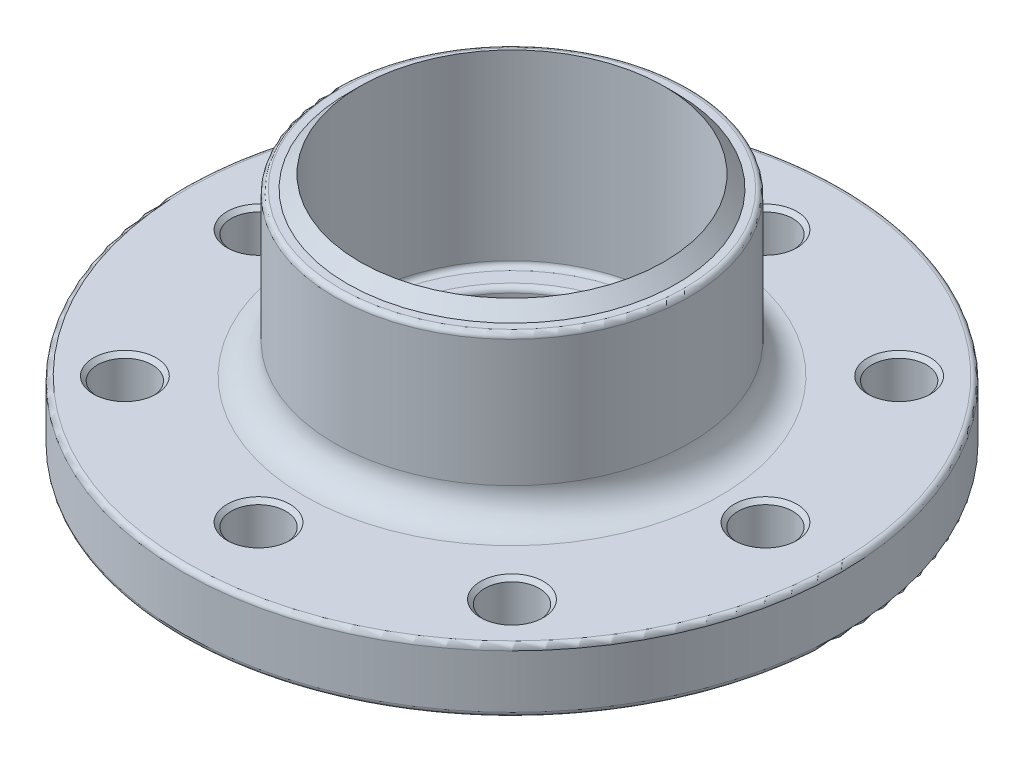
ISO-10303-21;
HEADER;
FILE_DESCRIPTION(('STEP AP214'),'2;1');
FILE_NAME('part.step','',(''),(''),'','','');
FILE_SCHEMA(('AUTOMOTIVE_DESIGN { 1 0 10303 214 1 1 1 1 }'));
ENDSEC;
DATA;
#1=APPLICATION_CONTEXT('core data for automotive mechanical design processes');
#2=APPLICATION_PROTOCOL_DEFINITION('international standard','automotive_design',2000,#1);
#3=PRODUCT_CONTEXT('',#1,'mechanical');
#4=PRODUCT('Part','Part','',(#3));
#5=PRODUCT_RELATED_PRODUCT_CATEGORY('part','',(#4));
#6=PRODUCT_DEFINITION_FORMATION('','',#4);
#7=PRODUCT_DEFINITION_CONTEXT('part definition',#1,'design');
#8=PRODUCT_DEFINITION('design','',#6,#7);
#9=PRODUCT_DEFINITION_SHAPE('','',#8);
#10=(LENGTH_UNIT() NAMED_UNIT(*) SI_UNIT(.MILLI.,.METRE.));
#11=(NAMED_UNIT(*) PLANE_ANGLE_UNIT() SI_UNIT($,.RADIAN.));
#12=(NAMED_UNIT(*) SI_UNIT($,.STERADIAN.) SOLID_ANGLE_UNIT());
#13=UNCERTAINTY_MEASURE_WITH_UNIT(LENGTH_MEASURE(1.E-05),#10,'distance_accuracy_value','');
#14=(GEOMETRIC_REPRESENTATION_CONTEXT(3) GLOBAL_UNCERTAINTY_ASSIGNED_CONTEXT((#13)) GLOBAL_UNIT_ASSIGNED_CONTEXT((#10,
#11,#12)) REPRESENTATION_CONTEXT('',''));
#15=CARTESIAN_POINT('',(0.,0.,0.));
#16=DIRECTION('',(0.,0.,1.));
#17=DIRECTION('',(1.,0.,0.));
#18=AXIS2_PLACEMENT_3D('',#15,#16,#17);
#19=CARTESIAN_POINT('',(0.,-46.981561461794,0.));
#20=DIRECTION('',(0.,-1.,0.));
#21=DIRECTION('',(0.,0.,-1.));
#22=AXIS2_PLACEMENT_3D('',#19,#20,#21);
#23=CYLINDRICAL_SURFACE('',#22,30.);
#24=CARTESIAN_POINT('',(0.,13.1832225913621,0.));
#25=DIRECTION('',(0.,1.,0.));
#26=DIRECTION('',(0.,0.,1.));
#27=AXIS2_PLACEMENT_3D('',#24,#25,#26);
#28=CIRCLE('',#27,30.);
#29=CARTESIAN_POINT('',(0.,13.1832225913621,30.));
#30=VERTEX_POINT('',#29);
#31=EDGE_CURVE('E180',#30,#30,#28,.F.);
#32=ORIENTED_EDGE('',*,*,#31,.T.);
#33=EDGE_LOOP('',(#32));
#34=FACE_BOUND('',#33,.T.);
#35=CARTESIAN_POINT('',(0.,49.1832225913621,0.));
#36=DIRECTION('',(0.,-1.,0.));
#37=DIRECTION('',(0.,0.,-1.));
#38=AXIS2_PLACEMENT_3D('',#35,#36,#37);
#39=CIRCLE('',#38,30.);
#40=CARTESIAN_POINT('',(0.,49.1832225913621,-30.));
#41=VERTEX_POINT('',#40);
#42=EDGE_CURVE('E189',#41,#41,#39,.T.);
#43=ORIENTED_EDGE('',*,*,#42,.F.);
#44=EDGE_LOOP('',(#43));
#45=FACE_BOUND('',#44,.T.);
#46=ADVANCED_FACE('F31',(#34,#45),#23,.F.);
#47=CARTESIAN_POINT('',(0.,46.6832225913621,0.));
#48=DIRECTION('',(0.,-1.,0.));
#49=DIRECTION('',(0.,0.,-1.));
#50=AXIS2_PLACEMENT_3D('',#47,#48,#49);
#51=CONICAL_SURFACE('',#50,32.4999999999999,0.785398163397437);
#52=ORIENTED_EDGE('',*,*,#42,.T.);
#53=EDGE_LOOP('',(#52));
#54=FACE_BOUND('',#53,.T.);
#55=CARTESIAN_POINT('',(0.,46.6832225913621,0.));
#56=DIRECTION('',(0.,-1.,0.));
#57=DIRECTION('',(0.,0.,-1.));
#58=AXIS2_PLACEMENT_3D('',#55,#56,#57);
#59=CIRCLE('',#58,32.4999999999999);
#60=CARTESIAN_POINT('',(0.,46.6832225913621,-32.4999999999999));
#61=VERTEX_POINT('',#60);
#62=EDGE_CURVE('E192',#61,#61,#59,.T.);
#63=ORIENTED_EDGE('',*,*,#62,.F.);
#64=EDGE_LOOP('',(#63));
#65=FACE_BOUND('',#64,.T.);
#66=ADVANCED_FACE('F198',(#54,#65),#51,.T.);
#67=CARTESIAN_POINT('',(32.4999999999999,46.6832225913621,0.));
#68=DIRECTION('',(0.,1.,0.));
#69=DIRECTION('',(0.,0.,1.));
#70=AXIS2_PLACEMENT_3D('',#67,#68,#69);
#71=PLANE('',#70);
#72=CARTESIAN_POINT('',(0.,46.6832225913621,0.));
#73=DIRECTION('',(0.,1.,0.));
#74=DIRECTION('',(0.,0.,1.));
#75=AXIS2_PLACEMENT_3D('',#72,#73,#74);
#76=CIRCLE('',#75,34.);
#77=CARTESIAN_POINT('',(0.,46.6832225913621,34.));
#78=VERTEX_POINT('',#77);
#79=EDGE_CURVE('E159',#78,#78,#76,.T.);
#80=ORIENTED_EDGE('',*,*,#79,.T.);
#81=EDGE_LOOP('',(#80));
#82=FACE_BOUND('',#81,.T.);
#83=ORIENTED_EDGE('',*,*,#62,.T.);
#84=EDGE_LOOP('',(#83));
#85=FACE_BOUND('',#84,.T.);
#86=ADVANCED_FACE('F196',(#82,#85),#71,.T.);
#87=CARTESIAN_POINT('',(0.,-46.981561461794,0.));
#88=DIRECTION('',(0.,-1.,0.));
#89=DIRECTION('',(0.,0.,-1.));
#90=AXIS2_PLACEMENT_3D('',#87,#88,#89);
#91=CYLINDRICAL_SURFACE('',#90,35.);
#92=CARTESIAN_POINT('',(0.,45.6832225913621,0.));
#93=DIRECTION('',(0.,1.,0.));
#94=DIRECTION('',(0.,0.,1.));
#95=AXIS2_PLACEMENT_3D('',#92,#93,#94);
#96=CIRCLE('',#95,35.);
#97=CARTESIAN_POINT('',(0.,45.6832225913621,35.));
#98=VERTEX_POINT('',#97);
#99=EDGE_CURVE('E162',#98,#98,#96,.F.);
#100=ORIENTED_EDGE('',*,*,#99,.T.);
#101=EDGE_LOOP('',(#100));
#102=FACE_BOUND('',#101,.T.);
#103=CARTESIAN_POINT('',(0.,20.6832225913621,0.));
#104=DIRECTION('',(0.,1.,0.));
#105=DIRECTION('',(0.,0.,1.));
#106=AXIS2_PLACEMENT_3D('',#103,#104,#105);
#107=CIRCLE('',#106,35.);
#108=CARTESIAN_POINT('',(0.,20.6832225913621,35.));
#109=VERTEX_POINT('',#108);
#110=EDGE_CURVE('E183',#109,#109,#107,.T.);
#111=ORIENTED_EDGE('',*,*,#110,.T.);
#112=EDGE_LOOP('',(#111));
#113=FACE_BOUND('',#112,.T.);
#114=ADVANCED_FACE('F206',(#102,#113),#91,.T.);
#115=CARTESIAN_POINT('',(35.,14.6832225913621,0.));
#116=DIRECTION('',(0.,1.,0.));
#117=DIRECTION('',(0.,0.,1.));
#118=AXIS2_PLACEMENT_3D('',#115,#116,#117);
#119=PLANE('',#118);
#120=CARTESIAN_POINT('',(-38.183766184074,14.6832225913621,-38.1837661840731));
#121=DIRECTION('',(0.,1.,0.));
#122=DIRECTION('',(0.,0.,1.));
#123=AXIS2_PLACEMENT_3D('',#120,#121,#122);
#124=CIRCLE('',#123,6.20000000000002);
#125=CARTESIAN_POINT('',(-38.183766184074,14.6832225913621,-31.9837661840731));
#126=VERTEX_POINT('',#125);
#127=EDGE_CURVE('E81',#126,#126,#124,.F.);
#128=ORIENTED_EDGE('',*,*,#127,.T.);
#129=EDGE_LOOP('',(#128));
#130=FACE_BOUND('',#129,.T.);
#131=CARTESIAN_POINT('',(-3.49148133884313E-13,14.6832225913621,-50.));
#132=DIRECTION('',(0.,1.,0.));
#133=DIRECTION('',(0.,0.,1.));
#134=AXIS2_PLACEMENT_3D('',#131,#132,#133);
#135=CIRCLE('',#134,6.20000000000002);
#136=CARTESIAN_POINT('',(-3.49148133884313E-13,14.6832225913621,-43.8));
#137=VERTEX_POINT('',#136);
#138=EDGE_CURVE('E84',#137,#137,#135,.F.);
#139=ORIENTED_EDGE('',*,*,#138,.T.);
#140=EDGE_LOOP('',(#139));
#141=FACE_BOUND('',#140,.T.);
#142=CARTESIAN_POINT('',(38.1837661840732,14.6832225913621,-38.1837661840739));
#143=DIRECTION('',(0.,1.,0.));
#144=DIRECTION('',(0.,0.,1.));
#145=AXIS2_PLACEMENT_3D('',#142,#143,#144);
#146=CIRCLE('',#145,6.20000000000002);
#147=CARTESIAN_POINT('',(38.1837661840732,14.6832225913621,-31.9837661840739));
#148=VERTEX_POINT('',#147);
#149=EDGE_CURVE('E87',#148,#148,#146,.F.);
#150=ORIENTED_EDGE('',*,*,#149,.T.);
#151=EDGE_LOOP('',(#150));
#152=FACE_BOUND('',#151,.T.);
#153=CARTESIAN_POINT('',(50.,14.6832225913621,-1.74574066942157E-13));
#154=DIRECTION('',(0.,1.,0.));
#155=DIRECTION('',(0.,0.,1.));
#156=AXIS2_PLACEMENT_3D('',#153,#154,#155);
#157=CIRCLE('',#156,6.20000000000001);
#158=CARTESIAN_POINT('',(50.,14.6832225913621,6.19999999999984));
#159=VERTEX_POINT('',#158);
#160=EDGE_CURVE('E90',#159,#159,#157,.F.);
#161=ORIENTED_EDGE('',*,*,#160,.T.);
#162=EDGE_LOOP('',(#161));
#163=FACE_BOUND('',#162,.T.);
#164=CARTESIAN_POINT('',(38.1837661840738,14.6832225913621,38.1837661840734));
#165=DIRECTION('',(0.,1.,0.));
#166=DIRECTION('',(0.,0.,1.));
#167=AXIS2_PLACEMENT_3D('',#164,#165,#166);
#168=CIRCLE('',#167,6.20000000000002);
#169=CARTESIAN_POINT('',(38.1837661840738,14.6832225913621,44.3837661840734));
#170=VERTEX_POINT('',#169);
#171=EDGE_CURVE('E93',#170,#170,#168,.F.);
#172=ORIENTED_EDGE('',*,*,#171,.T.);
#173=EDGE_LOOP('',(#172));
#174=FACE_BOUND('',#173,.T.);
#175=CARTESIAN_POINT('',(0.,14.6832225913621,50.));
#176=DIRECTION('',(0.,1.,0.));
#177=DIRECTION('',(0.,0.,1.));
#178=AXIS2_PLACEMENT_3D('',#175,#176,#177);
#179=CIRCLE('',#178,6.20000000000002);
#180=CARTESIAN_POINT('',(0.,14.6832225913621,56.2));
#181=VERTEX_POINT('',#180);
#182=EDGE_CURVE('E96',#181,#181,#179,.F.);
#183=ORIENTED_EDGE('',*,*,#182,.T.);
#184=EDGE_LOOP('',(#183));
#185=FACE_BOUND('',#184,.T.);
#186=CARTESIAN_POINT('',(-38.1837661840735,14.6832225913621,38.1837661840736));
#187=DIRECTION('',(0.,1.,0.));
#188=DIRECTION('',(0.,0.,1.));
#189=AXIS2_PLACEMENT_3D('',#186,#187,#188);
#190=CIRCLE('',#189,6.20000000000001);
#191=CARTESIAN_POINT('',(-38.1837661840735,14.6832225913621,44.3837661840736));
#192=VERTEX_POINT('',#191);
#193=EDGE_CURVE('E99',#192,#192,#190,.F.);
#194=ORIENTED_EDGE('',*,*,#193,.T.);
#195=EDGE_LOOP('',(#194));
#196=FACE_BOUND('',#195,.T.);
#197=CARTESIAN_POINT('',(-50.,14.6832225913621,5.2372220082647E-13));
#198=DIRECTION('',(0.,1.,0.));
#199=DIRECTION('',(0.,0.,1.));
#200=AXIS2_PLACEMENT_3D('',#197,#198,#199);
#201=CIRCLE('',#200,6.20000000000001);
#202=CARTESIAN_POINT('',(-50.,14.6832225913621,6.20000000000054));
#203=VERTEX_POINT('',#202);
#204=EDGE_CURVE('E102',#203,#203,#201,.F.);
#205=ORIENTED_EDGE('',*,*,#204,.T.);
#206=EDGE_LOOP('',(#205));
#207=FACE_BOUND('',#206,.T.);
#208=CARTESIAN_POINT('',(0.,14.6832225913621,0.));
#209=DIRECTION('',(0.,1.,0.));
#210=DIRECTION('',(0.,0.,1.));
#211=AXIS2_PLACEMENT_3D('',#208,#209,#210);
#212=CIRCLE('',#211,64.);
#213=CARTESIAN_POINT('',(0.,14.6832225913621,64.));
#214=VERTEX_POINT('',#213);
#215=EDGE_CURVE('E165',#214,#214,#212,.T.);
#216=ORIENTED_EDGE('',*,*,#215,.T.);
#217=EDGE_LOOP('',(#216));
#218=FACE_BOUND('',#217,.T.);
#219=CARTESIAN_POINT('',(0.,14.6832225913621,0.));
#220=DIRECTION('',(0.,1.,0.));
#221=DIRECTION('',(0.,0.,1.));
#222=AXIS2_PLACEMENT_3D('',#219,#220,#221);
#223=CIRCLE('',#222,41.);
#224=CARTESIAN_POINT('',(0.,14.6832225913621,41.));
#225=VERTEX_POINT('',#224);
#226=EDGE_CURVE('E186',#225,#225,#223,.F.);
#227=ORIENTED_EDGE('',*,*,#226,.T.);
#228=EDGE_LOOP('',(#227));
#229=FACE_BOUND('',#228,.T.);
#230=ADVANCED_FACE('F346',(#130,#141,#152,#163,#174,#185,#196,#207,#218,#229),#119,.T.);
#231=CARTESIAN_POINT('',(0.,-46.981561461794,0.));
#232=DIRECTION('',(0.,-1.,0.));
#233=DIRECTION('',(0.,0.,-1.));
#234=AXIS2_PLACEMENT_3D('',#231,#232,#233);
#235=CYLINDRICAL_SURFACE('',#234,65.);
#236=CARTESIAN_POINT('',(0.,3.18322259136213,0.));
#237=DIRECTION('',(0.,-1.,0.));
#238=DIRECTION('',(0.,0.,-1.));
#239=AXIS2_PLACEMENT_3D('',#236,#237,#238);
#240=CIRCLE('',#239,65.);
#241=CARTESIAN_POINT('',(0.,3.18322259136213,-65.));
#242=VERTEX_POINT('',#241);
#243=EDGE_CURVE('E168',#242,#242,#240,.F.);
#244=ORIENTED_EDGE('',*,*,#243,.T.);
#245=EDGE_LOOP('',(#244));
#246=FACE_BOUND('',#245,.T.);
#247=CARTESIAN_POINT('',(0.,13.6832225913621,0.));
#248=DIRECTION('',(0.,1.,0.));
#249=DIRECTION('',(0.,0.,1.));
#250=AXIS2_PLACEMENT_3D('',#247,#248,#249);
#251=CIRCLE('',#250,65.);
#252=CARTESIAN_POINT('',(0.,13.6832225913621,65.));
#253=VERTEX_POINT('',#252);
#254=EDGE_CURVE('E171',#253,#253,#251,.F.);
#255=ORIENTED_EDGE('',*,*,#254,.T.);
#256=EDGE_LOOP('',(#255));
#257=FACE_BOUND('',#256,.T.);
#258=ADVANCED_FACE('F321',(#246,#257),#235,.T.);
#259=CARTESIAN_POINT('',(65.,2.18322259136212,0.));
#260=DIRECTION('',(0.,-1.,0.));
#261=DIRECTION('',(0.,0.,-1.));
#262=AXIS2_PLACEMENT_3D('',#259,#260,#261);
#263=PLANE('',#262);
#264=CARTESIAN_POINT('',(-38.183766184074,2.18322259136212,-38.1837661840731));
#265=DIRECTION('',(0.,-1.,0.));
#266=DIRECTION('',(0.,0.,-1.));
#267=AXIS2_PLACEMENT_3D('',#264,#265,#266);
#268=CIRCLE('',#267,6.20000000000001);
#269=CARTESIAN_POINT('',(-38.183766184074,2.18322259136212,-44.3837661840731));
#270=VERTEX_POINT('',#269);
#271=EDGE_CURVE('E105',#270,#270,#268,.F.);
#272=ORIENTED_EDGE('',*,*,#271,.T.);
#273=EDGE_LOOP('',(#272));
#274=FACE_BOUND('',#273,.T.);
#275=CARTESIAN_POINT('',(-3.49148133884313E-13,2.18322259136212,-50.));
#276=DIRECTION('',(0.,-1.,0.));
#277=DIRECTION('',(0.,0.,-1.));
#278=AXIS2_PLACEMENT_3D('',#275,#276,#277);
#279=CIRCLE('',#278,6.20000000000001);
#280=CARTESIAN_POINT('',(-3.49148133884313E-13,2.18322259136212,-56.2));
#281=VERTEX_POINT('',#280);
#282=EDGE_CURVE('E108',#281,#281,#279,.F.);
#283=ORIENTED_EDGE('',*,*,#282,.T.);
#284=EDGE_LOOP('',(#283));
#285=FACE_BOUND('',#284,.T.);
#286=CARTESIAN_POINT('',(38.1837661840732,2.18322259136212,-38.1837661840739));
#287=DIRECTION('',(0.,-1.,0.));
#288=DIRECTION('',(0.,0.,-1.));
#289=AXIS2_PLACEMENT_3D('',#286,#287,#288);
#290=CIRCLE('',#289,6.20000000000001);
#291=CARTESIAN_POINT('',(38.1837661840732,2.18322259136212,-44.3837661840739));
#292=VERTEX_POINT('',#291);
#293=EDGE_CURVE('E111',#292,#292,#290,.F.);
#294=ORIENTED_EDGE('',*,*,#293,.T.);
#295=EDGE_LOOP('',(#294));
#296=FACE_BOUND('',#295,.T.);
#297=CARTESIAN_POINT('',(50.,2.18322259136212,-1.74574066942157E-13));
#298=DIRECTION('',(0.,-1.,0.));
#299=DIRECTION('',(0.,0.,-1.));
#300=AXIS2_PLACEMENT_3D('',#297,#298,#299);
#301=CIRCLE('',#300,6.20000000000001);
#302=CARTESIAN_POINT('',(50.,2.18322259136212,-6.20000000000019));
#303=VERTEX_POINT('',#302);
#304=EDGE_CURVE('E114',#303,#303,#301,.F.);
#305=ORIENTED_EDGE('',*,*,#304,.T.);
#306=EDGE_LOOP('',(#305));
#307=FACE_BOUND('',#306,.T.);
#308=CARTESIAN_POINT('',(38.1837661840738,2.18322259136212,38.1837661840734));
#309=DIRECTION('',(0.,-1.,0.));
#310=DIRECTION('',(0.,0.,-1.));
#311=AXIS2_PLACEMENT_3D('',#308,#309,#310);
#312=CIRCLE('',#311,6.20000000000001);
#313=CARTESIAN_POINT('',(38.1837661840738,2.18322259136212,31.9837661840733));
#314=VERTEX_POINT('',#313);
#315=EDGE_CURVE('E117',#314,#314,#312,.F.);
#316=ORIENTED_EDGE('',*,*,#315,.T.);
#317=EDGE_LOOP('',(#316));
#318=FACE_BOUND('',#317,.T.);
#319=CARTESIAN_POINT('',(0.,2.18322259136212,50.));
#320=DIRECTION('',(0.,-1.,0.));
#321=DIRECTION('',(0.,0.,-1.));
#322=AXIS2_PLACEMENT_3D('',#319,#320,#321);
#323=CIRCLE('',#322,6.20000000000001);
#324=CARTESIAN_POINT('',(0.,2.18322259136212,43.8));
#325=VERTEX_POINT('',#324);
#326=EDGE_CURVE('E120',#325,#325,#323,.F.);
#327=ORIENTED_EDGE('',*,*,#326,.T.);
#328=EDGE_LOOP('',(#327));
#329=FACE_BOUND('',#328,.T.);
#330=CARTESIAN_POINT('',(-38.1837661840735,2.18322259136212,38.1837661840736));
#331=DIRECTION('',(0.,-1.,0.));
#332=DIRECTION('',(0.,0.,-1.));
#333=AXIS2_PLACEMENT_3D('',#330,#331,#332);
#334=CIRCLE('',#333,6.20000000000001);
#335=CARTESIAN_POINT('',(-38.1837661840735,2.18322259136212,31.9837661840736));
#336=VERTEX_POINT('',#335);
#337=EDGE_CURVE('E123',#336,#336,#334,.F.);
#338=ORIENTED_EDGE('',*,*,#337,.T.);
#339=EDGE_LOOP('',(#338));
#340=FACE_BOUND('',#339,.T.);
#341=CARTESIAN_POINT('',(-50.,2.18322259136212,5.2372220082647E-13));
#342=DIRECTION('',(0.,-1.,0.));
#343=DIRECTION('',(0.,0.,-1.));
#344=AXIS2_PLACEMENT_3D('',#341,#342,#343);
#345=CIRCLE('',#344,6.20000000000007);
#346=CARTESIAN_POINT('',(-50.,2.18322259136212,-6.19999999999954));
#347=VERTEX_POINT('',#346);
#348=EDGE_CURVE('E126',#347,#347,#345,.F.);
#349=ORIENTED_EDGE('',*,*,#348,.T.);
#350=EDGE_LOOP('',(#349));
#351=FACE_BOUND('',#350,.T.);
#352=CARTESIAN_POINT('',(0.,2.18322259136212,0.));
#353=DIRECTION('',(0.,-1.,0.));
#354=DIRECTION('',(0.,0.,-1.));
#355=AXIS2_PLACEMENT_3D('',#352,#353,#354);
#356=CIRCLE('',#355,28.5);
#357=CARTESIAN_POINT('',(0.,2.18322259136212,-28.5));
#358=VERTEX_POINT('',#357);
#359=EDGE_CURVE('E135',#358,#358,#356,.F.);
#360=ORIENTED_EDGE('',*,*,#359,.T.);
#361=EDGE_LOOP('',(#360));
#362=FACE_BOUND('',#361,.T.);
#363=CARTESIAN_POINT('',(0.,2.18322259136212,0.));
#364=DIRECTION('',(0.,-1.,0.));
#365=DIRECTION('',(0.,0.,-1.));
#366=AXIS2_PLACEMENT_3D('',#363,#364,#365);
#367=CIRCLE('',#366,64.);
#368=CARTESIAN_POINT('',(0.,2.18322259136212,-64.));
#369=VERTEX_POINT('',#368);
#370=EDGE_CURVE('E174',#369,#369,#367,.T.);
#371=ORIENTED_EDGE('',*,*,#370,.T.);
#372=EDGE_LOOP('',(#371));
#373=FACE_BOUND('',#372,.T.);
#374=ADVANCED_FACE('F317',(#274,#285,#296,#307,#318,#329,#340,#351,#362,#373),#263,.T.);
#375=CARTESIAN_POINT('',(0.,-46.981561461794,0.));
#376=DIRECTION('',(0.,-1.,0.));
#377=DIRECTION('',(0.,0.,-1.));
#378=AXIS2_PLACEMENT_3D('',#375,#376,#377);
#379=CYLINDRICAL_SURFACE('',#378,27.5);
#380=CARTESIAN_POINT('',(0.,-14.8167774086379,0.));
#381=DIRECTION('',(0.,-1.,0.));
#382=DIRECTION('',(0.,0.,-1.));
#383=AXIS2_PLACEMENT_3D('',#380,#381,#382);
#384=CIRCLE('',#383,27.5);
#385=CARTESIAN_POINT('',(0.,-14.8167774086379,-27.5));
#386=VERTEX_POINT('',#385);
#387=EDGE_CURVE('E138',#386,#386,#384,.F.);
#388=ORIENTED_EDGE('',*,*,#387,.T.);
#389=EDGE_LOOP('',(#388));
#390=FACE_BOUND('',#389,.T.);
#391=CARTESIAN_POINT('',(0.,1.18322259136212,0.));
#392=DIRECTION('',(0.,-1.,0.));
#393=DIRECTION('',(0.,0.,-1.));
#394=AXIS2_PLACEMENT_3D('',#391,#392,#393);
#395=CIRCLE('',#394,27.5);
#396=CARTESIAN_POINT('',(0.,1.18322259136212,-27.5));
#397=VERTEX_POINT('',#396);
#398=EDGE_CURVE('E141',#397,#397,#395,.T.);
#399=ORIENTED_EDGE('',*,*,#398,.T.);
#400=EDGE_LOOP('',(#399));
#401=FACE_BOUND('',#400,.T.);
#402=ADVANCED_FACE('F320',(#390,#401),#379,.T.);
#403=CARTESIAN_POINT('',(27.5,-15.8167774086379,0.));
#404=DIRECTION('',(0.,-1.,0.));
#405=DIRECTION('',(0.,0.,-1.));
#406=AXIS2_PLACEMENT_3D('',#403,#404,#405);
#407=PLANE('',#406);
#408=CARTESIAN_POINT('',(0.,-15.8167774086379,0.));
#409=DIRECTION('',(0.,-1.,0.));
#410=DIRECTION('',(0.,0.,-1.));
#411=AXIS2_PLACEMENT_3D('',#408,#409,#410);
#412=CIRCLE('',#411,26.);
#413=CARTESIAN_POINT('',(0.,-15.8167774086379,-26.));
#414=VERTEX_POINT('',#413);
#415=EDGE_CURVE('E144',#414,#414,#412,.F.);
#416=ORIENTED_EDGE('',*,*,#415,.T.);
#417=EDGE_LOOP('',(#416));
#418=FACE_BOUND('',#417,.T.);
#419=CARTESIAN_POINT('',(0.,-15.8167774086379,0.));
#420=DIRECTION('',(0.,-1.,0.));
#421=DIRECTION('',(0.,0.,-1.));
#422=AXIS2_PLACEMENT_3D('',#419,#420,#421);
#423=CIRCLE('',#422,26.5);
#424=CARTESIAN_POINT('',(0.,-15.8167774086379,-26.5));
#425=VERTEX_POINT('',#424);
#426=EDGE_CURVE('E147',#425,#425,#423,.T.);
#427=ORIENTED_EDGE('',*,*,#426,.T.);
#428=EDGE_LOOP('',(#427));
#429=FACE_BOUND('',#428,.T.);
#430=ADVANCED_FACE('F332',(#418,#429),#407,.T.);
#431=CARTESIAN_POINT('',(0.,-46.981561461794,0.));
#432=DIRECTION('',(0.,-1.,0.));
#433=DIRECTION('',(0.,0.,-1.));
#434=AXIS2_PLACEMENT_3D('',#431,#432,#433);
#435=CYLINDRICAL_SURFACE('',#434,25.);
#436=CARTESIAN_POINT('',(0.,11.1832225913621,0.));
#437=DIRECTION('',(0.,1.,0.));
#438=DIRECTION('',(0.,0.,1.));
#439=AXIS2_PLACEMENT_3D('',#436,#437,#438);
#440=CIRCLE('',#439,25.);
#441=CARTESIAN_POINT('',(0.,11.1832225913621,25.));
#442=VERTEX_POINT('',#441);
#443=EDGE_CURVE('E150',#442,#442,#440,.T.);
#444=ORIENTED_EDGE('',*,*,#443,.T.);
#445=EDGE_LOOP('',(#444));
#446=FACE_BOUND('',#445,.T.);
#447=CARTESIAN_POINT('',(0.,-14.8167774086379,0.));
#448=DIRECTION('',(0.,-1.,0.));
#449=DIRECTION('',(0.,0.,-1.));
#450=AXIS2_PLACEMENT_3D('',#447,#448,#449);
#451=CIRCLE('',#450,25.);
#452=CARTESIAN_POINT('',(0.,-14.8167774086379,-25.));
#453=VERTEX_POINT('',#452);
#454=EDGE_CURVE('E153',#453,#453,#451,.T.);
#455=ORIENTED_EDGE('',*,*,#454,.T.);
#456=EDGE_LOOP('',(#455));
#457=FACE_BOUND('',#456,.T.);
#458=ADVANCED_FACE('F339',(#446,#457),#435,.F.);
#459=CARTESIAN_POINT('',(25.,12.1832225913621,0.));
#460=DIRECTION('',(0.,1.,0.));
#461=DIRECTION('',(0.,0.,1.));
#462=AXIS2_PLACEMENT_3D('',#459,#460,#461);
#463=PLANE('',#462);
#464=CARTESIAN_POINT('',(0.,12.1832225913621,0.));
#465=DIRECTION('',(0.,1.,0.));
#466=DIRECTION('',(0.,0.,1.));
#467=AXIS2_PLACEMENT_3D('',#464,#465,#466);
#468=CIRCLE('',#467,26.);
#469=CARTESIAN_POINT('',(0.,12.1832225913621,26.));
#470=VERTEX_POINT('',#469);
#471=EDGE_CURVE('E156',#470,#470,#468,.F.);
#472=ORIENTED_EDGE('',*,*,#471,.T.);
#473=EDGE_LOOP('',(#472));
#474=FACE_BOUND('',#473,.T.);
#475=CARTESIAN_POINT('',(0.,12.1832225913621,0.));
#476=DIRECTION('',(0.,1.,0.));
#477=DIRECTION('',(0.,0.,1.));
#478=AXIS2_PLACEMENT_3D('',#475,#476,#477);
#479=CIRCLE('',#478,29.);
#480=CARTESIAN_POINT('',(0.,12.1832225913621,29.));
#481=VERTEX_POINT('',#480);
#482=EDGE_CURVE('E177',#481,#481,#479,.T.);
#483=ORIENTED_EDGE('',*,*,#482,.T.);
#484=EDGE_LOOP('',(#483));
#485=FACE_BOUND('',#484,.T.);
#486=ADVANCED_FACE('F217',(#474,#485),#463,.T.);
#487=CARTESIAN_POINT('',(0.,20.6832225913621,0.));
#488=DIRECTION('',(0.,1.,0.));
#489=DIRECTION('',(0.,0.,1.));
#490=AXIS2_PLACEMENT_3D('',#487,#488,#489);
#491=TOROIDAL_SURFACE('',#490,41.,6.);
#492=ORIENTED_EDGE('',*,*,#110,.F.);
#493=EDGE_LOOP('',(#492));
#494=FACE_BOUND('',#493,.T.);
#495=ORIENTED_EDGE('',*,*,#226,.F.);
#496=EDGE_LOOP('',(#495));
#497=FACE_BOUND('',#496,.T.);
#498=ADVANCED_FACE('F213',(#494,#497),#491,.F.);
#499=CARTESIAN_POINT('',(0.,13.1832225913621,0.));
#500=DIRECTION('',(0.,1.,0.));
#501=DIRECTION('',(0.,0.,1.));
#502=AXIS2_PLACEMENT_3D('',#499,#500,#501);
#503=TOROIDAL_SURFACE('',#502,29.,1.);
#504=ORIENTED_EDGE('',*,*,#482,.F.);
#505=EDGE_LOOP('',(#504));
#506=FACE_BOUND('',#505,.T.);
#507=ORIENTED_EDGE('',*,*,#31,.F.);
#508=EDGE_LOOP('',(#507));
#509=FACE_BOUND('',#508,.T.);
#510=ADVANCED_FACE('F216',(#506,#509),#503,.F.);
#511=CARTESIAN_POINT('',(0.,3.18322259136213,0.));
#512=DIRECTION('',(0.,-1.,0.));
#513=DIRECTION('',(0.,0.,-1.));
#514=AXIS2_PLACEMENT_3D('',#511,#512,#513);
#515=TOROIDAL_SURFACE('',#514,64.,1.);
#516=ORIENTED_EDGE('',*,*,#243,.F.);
#517=EDGE_LOOP('',(#516));
#518=FACE_BOUND('',#517,.T.);
#519=ORIENTED_EDGE('',*,*,#370,.F.);
#520=EDGE_LOOP('',(#519));
#521=FACE_BOUND('',#520,.T.);
#522=ADVANCED_FACE('F221',(#518,#521),#515,.T.);
#523=CARTESIAN_POINT('',(0.,13.6832225913621,0.));
#524=DIRECTION('',(0.,1.,0.));
#525=DIRECTION('',(0.,0.,1.));
#526=AXIS2_PLACEMENT_3D('',#523,#524,#525);
#527=TOROIDAL_SURFACE('',#526,64.,1.);
#528=ORIENTED_EDGE('',*,*,#215,.F.);
#529=EDGE_LOOP('',(#528));
#530=FACE_BOUND('',#529,.T.);
#531=ORIENTED_EDGE('',*,*,#254,.F.);
#532=EDGE_LOOP('',(#531));
#533=FACE_BOUND('',#532,.T.);
#534=ADVANCED_FACE('F225',(#530,#533),#527,.T.);
#535=CARTESIAN_POINT('',(0.,45.6832225913621,0.));
#536=DIRECTION('',(0.,1.,0.));
#537=DIRECTION('',(0.,0.,1.));
#538=AXIS2_PLACEMENT_3D('',#535,#536,#537);
#539=TOROIDAL_SURFACE('',#538,34.,1.);
#540=ORIENTED_EDGE('',*,*,#79,.F.);
#541=EDGE_LOOP('',(#540));
#542=FACE_BOUND('',#541,.T.);
#543=ORIENTED_EDGE('',*,*,#99,.F.);
#544=EDGE_LOOP('',(#543));
#545=FACE_BOUND('',#544,.T.);
#546=ADVANCED_FACE('F229',(#542,#545),#539,.T.);
#547=CARTESIAN_POINT('',(0.,11.1832225913621,0.));
#548=DIRECTION('',(0.,1.,0.));
#549=DIRECTION('',(0.,0.,1.));
#550=AXIS2_PLACEMENT_3D('',#547,#548,#549);
#551=TOROIDAL_SURFACE('',#550,26.,1.);
#552=ORIENTED_EDGE('',*,*,#443,.F.);
#553=EDGE_LOOP('',(#552));
#554=FACE_BOUND('',#553,.T.);
#555=ORIENTED_EDGE('',*,*,#471,.F.);
#556=EDGE_LOOP('',(#555));
#557=FACE_BOUND('',#556,.T.);
#558=ADVANCED_FACE('F233',(#554,#557),#551,.T.);
#559=CARTESIAN_POINT('',(0.,-14.8167774086379,0.));
#560=DIRECTION('',(0.,-1.,0.));
#561=DIRECTION('',(0.,0.,-1.));
#562=AXIS2_PLACEMENT_3D('',#559,#560,#561);
#563=TOROIDAL_SURFACE('',#562,26.,1.);
#564=ORIENTED_EDGE('',*,*,#415,.F.);
#565=EDGE_LOOP('',(#564));
#566=FACE_BOUND('',#565,.T.);
#567=ORIENTED_EDGE('',*,*,#454,.F.);
#568=EDGE_LOOP('',(#567));
#569=FACE_BOUND('',#568,.T.);
#570=ADVANCED_FACE('F237',(#566,#569),#563,.T.);
#571=CARTESIAN_POINT('',(0.,-14.8167774086379,0.));
#572=DIRECTION('',(0.,-1.,0.));
#573=DIRECTION('',(0.,0.,-1.));
#574=AXIS2_PLACEMENT_3D('',#571,#572,#573);
#575=TOROIDAL_SURFACE('',#574,26.5,1.);
#576=ORIENTED_EDGE('',*,*,#387,.F.);
#577=EDGE_LOOP('',(#576));
#578=FACE_BOUND('',#577,.T.);
#579=ORIENTED_EDGE('',*,*,#426,.F.);
#580=EDGE_LOOP('',(#579));
#581=FACE_BOUND('',#580,.T.);
#582=ADVANCED_FACE('F241',(#578,#581),#575,.T.);
#583=CARTESIAN_POINT('',(0.,1.18322259136212,0.));
#584=DIRECTION('',(0.,-1.,0.));
#585=DIRECTION('',(0.,0.,-1.));
#586=AXIS2_PLACEMENT_3D('',#583,#584,#585);
#587=TOROIDAL_SURFACE('',#586,28.5,1.);
#588=ORIENTED_EDGE('',*,*,#359,.F.);
#589=EDGE_LOOP('',(#588));
#590=FACE_BOUND('',#589,.T.);
#591=ORIENTED_EDGE('',*,*,#398,.F.);
#592=EDGE_LOOP('',(#591));
#593=FACE_BOUND('',#592,.T.);
#594=ADVANCED_FACE('F245',(#590,#593),#587,.F.);
#595=CARTESIAN_POINT('',(0.,49.1832225913621,50.));
#596=DIRECTION('',(0.,-1.,0.));
#597=DIRECTION('',(0.,0.,-1.));
#598=AXIS2_PLACEMENT_3D('',#595,#596,#597);
#599=CYLINDRICAL_SURFACE('',#598,5.4);
#600=CARTESIAN_POINT('',(0.,2.98322259136213,50.));
#601=DIRECTION('',(0.,-1.,0.));
#602=DIRECTION('',(0.,0.,-1.));
#603=AXIS2_PLACEMENT_3D('',#600,#601,#602);
#604=CIRCLE('',#603,5.4);
#605=CARTESIAN_POINT('',(0.,2.98322259136213,44.6));
#606=VERTEX_POINT('',#605);
#607=EDGE_CURVE('E51',#606,#606,#604,.T.);
#608=ORIENTED_EDGE('',*,*,#607,.T.);
#609=EDGE_LOOP('',(#608));
#610=FACE_BOUND('',#609,.T.);
#611=CARTESIAN_POINT('',(0.,13.8832225913621,50.));
#612=DIRECTION('',(0.,1.,0.));
#613=DIRECTION('',(0.,0.,1.));
#614=AXIS2_PLACEMENT_3D('',#611,#612,#613);
#615=CIRCLE('',#614,5.4);
#616=CARTESIAN_POINT('',(0.,13.8832225913621,55.4));
#617=VERTEX_POINT('',#616);
#618=EDGE_CURVE('E54',#617,#617,#615,.T.);
#619=ORIENTED_EDGE('',*,*,#618,.T.);
#620=EDGE_LOOP('',(#619));
#621=FACE_BOUND('',#620,.T.);
#622=ADVANCED_FACE('F249',(#610,#621),#599,.F.);
#623=CARTESIAN_POINT('',(50.,49.1832225913621,-1.74574066942157E-13));
#624=DIRECTION('',(0.,-1.,0.));
#625=DIRECTION('',(0.,0.,-1.));
#626=AXIS2_PLACEMENT_3D('',#623,#624,#625);
#627=CYLINDRICAL_SURFACE('',#626,5.4);
#628=CARTESIAN_POINT('',(50.,2.98322259136212,-1.74574066942157E-13));
#629=DIRECTION('',(0.,-1.,0.));
#630=DIRECTION('',(0.,0.,-1.));
#631=AXIS2_PLACEMENT_3D('',#628,#629,#630);
#632=CIRCLE('',#631,5.4);
#633=CARTESIAN_POINT('',(50.,2.98322259136212,-5.40000000000017));
#634=VERTEX_POINT('',#633);
#635=EDGE_CURVE('E63',#634,#634,#632,.T.);
#636=ORIENTED_EDGE('',*,*,#635,.T.);
#637=EDGE_LOOP('',(#636));
#638=FACE_BOUND('',#637,.T.);
#639=CARTESIAN_POINT('',(50.,13.8832225913621,-1.74574066942157E-13));
#640=DIRECTION('',(0.,1.,0.));
#641=DIRECTION('',(0.,0.,1.));
#642=AXIS2_PLACEMENT_3D('',#639,#640,#641);
#643=CIRCLE('',#642,5.4);
#644=CARTESIAN_POINT('',(50.,13.8832225913621,5.39999999999983));
#645=VERTEX_POINT('',#644);
#646=EDGE_CURVE('E66',#645,#645,#643,.T.);
#647=ORIENTED_EDGE('',*,*,#646,.T.);
#648=EDGE_LOOP('',(#647));
#649=FACE_BOUND('',#648,.T.);
#650=ADVANCED_FACE('F387',(#638,#649),#627,.F.);
#651=CARTESIAN_POINT('',(-3.49148133884313E-13,49.1832225913621,-50.));
#652=DIRECTION('',(0.,-1.,0.));
#653=DIRECTION('',(0.,0.,-1.));
#654=AXIS2_PLACEMENT_3D('',#651,#652,#653);
#655=CYLINDRICAL_SURFACE('',#654,5.4);
#656=CARTESIAN_POINT('',(-3.49148133884313E-13,2.98322259136212,-50.));
#657=DIRECTION('',(0.,-1.,0.));
#658=DIRECTION('',(0.,0.,-1.));
#659=AXIS2_PLACEMENT_3D('',#656,#657,#658);
#660=CIRCLE('',#659,5.4);
#661=CARTESIAN_POINT('',(-3.49148133884313E-13,2.98322259136212,-55.4));
#662=VERTEX_POINT('',#661);
#663=EDGE_CURVE('E75',#662,#662,#660,.T.);
#664=ORIENTED_EDGE('',*,*,#663,.T.);
#665=EDGE_LOOP('',(#664));
#666=FACE_BOUND('',#665,.T.);
#667=CARTESIAN_POINT('',(-3.49148133884313E-13,13.8832225913621,-50.));
#668=DIRECTION('',(0.,1.,0.));
#669=DIRECTION('',(0.,0.,1.));
#670=AXIS2_PLACEMENT_3D('',#667,#668,#669);
#671=CIRCLE('',#670,5.4);
#672=CARTESIAN_POINT('',(-3.49148133884313E-13,13.8832225913621,-44.6));
#673=VERTEX_POINT('',#672);
#674=EDGE_CURVE('E78',#673,#673,#671,.T.);
#675=ORIENTED_EDGE('',*,*,#674,.T.);
#676=EDGE_LOOP('',(#675));
#677=FACE_BOUND('',#676,.T.);
#678=ADVANCED_FACE('F395',(#666,#677),#655,.F.);
#679=CARTESIAN_POINT('',(-50.,49.1832225913621,5.2372220082647E-13));
#680=DIRECTION('',(0.,-1.,0.));
#681=DIRECTION('',(0.,0.,-1.));
#682=AXIS2_PLACEMENT_3D('',#679,#680,#681);
#683=CYLINDRICAL_SURFACE('',#682,5.4);
#684=CARTESIAN_POINT('',(-50.,2.98322259136218,5.2372220082647E-13));
#685=DIRECTION('',(0.,-1.,0.));
#686=DIRECTION('',(0.,0.,-1.));
#687=AXIS2_PLACEMENT_3D('',#684,#685,#686);
#688=CIRCLE('',#687,5.4);
#689=CARTESIAN_POINT('',(-50.,2.98322259136218,-5.39999999999948));
#690=VERTEX_POINT('',#689);
#691=EDGE_CURVE('E10',#690,#690,#688,.T.);
#692=ORIENTED_EDGE('',*,*,#691,.T.);
#693=EDGE_LOOP('',(#692));
#694=FACE_BOUND('',#693,.T.);
#695=CARTESIAN_POINT('',(-50.,13.8832225913621,5.2372220082647E-13));
#696=DIRECTION('',(0.,1.,0.));
#697=DIRECTION('',(0.,0.,1.));
#698=AXIS2_PLACEMENT_3D('',#695,#696,#697);
#699=CIRCLE('',#698,5.4);
#700=CARTESIAN_POINT('',(-50.,13.8832225913621,5.40000000000052));
#701=VERTEX_POINT('',#700);
#702=EDGE_CURVE('E38',#701,#701,#699,.T.);
#703=ORIENTED_EDGE('',*,*,#702,.T.);
#704=EDGE_LOOP('',(#703));
#705=FACE_BOUND('',#704,.T.);
#706=ADVANCED_FACE('F403',(#694,#705),#683,.F.);
#707=CARTESIAN_POINT('',(-38.1837661840735,49.1832225913621,38.1837661840736));
#708=DIRECTION('',(0.,-1.,0.));
#709=DIRECTION('',(0.,0.,-1.));
#710=AXIS2_PLACEMENT_3D('',#707,#708,#709);
#711=CYLINDRICAL_SURFACE('',#710,5.40000000000001);
#712=CARTESIAN_POINT('',(-38.1837661840735,2.98322259136211,38.1837661840736));
#713=DIRECTION('',(0.,-1.,0.));
#714=DIRECTION('',(0.,0.,-1.));
#715=AXIS2_PLACEMENT_3D('',#712,#713,#714);
#716=CIRCLE('',#715,5.40000000000001);
#717=CARTESIAN_POINT('',(-38.1837661840735,2.98322259136211,32.7837661840736));
#718=VERTEX_POINT('',#717);
#719=EDGE_CURVE('E42',#718,#718,#716,.T.);
#720=ORIENTED_EDGE('',*,*,#719,.T.);
#721=EDGE_LOOP('',(#720));
#722=FACE_BOUND('',#721,.T.);
#723=CARTESIAN_POINT('',(-38.1837661840735,13.8832225913621,38.1837661840736));
#724=DIRECTION('',(0.,1.,0.));
#725=DIRECTION('',(0.,0.,1.));
#726=AXIS2_PLACEMENT_3D('',#723,#724,#725);
#727=CIRCLE('',#726,5.40000000000001);
#728=CARTESIAN_POINT('',(-38.1837661840735,13.8832225913621,43.5837661840736));
#729=VERTEX_POINT('',#728);
#730=EDGE_CURVE('E46',#729,#729,#727,.T.);
#731=ORIENTED_EDGE('',*,*,#730,.T.);
#732=EDGE_LOOP('',(#731));
#733=FACE_BOUND('',#732,.T.);
#734=ADVANCED_FACE('F411',(#722,#733),#711,.F.);
#735=CARTESIAN_POINT('',(38.1837661840738,49.1832225913621,38.1837661840734));
#736=DIRECTION('',(0.,-1.,0.));
#737=DIRECTION('',(0.,0.,-1.));
#738=AXIS2_PLACEMENT_3D('',#735,#736,#737);
#739=CYLINDRICAL_SURFACE('',#738,5.40000000000001);
#740=CARTESIAN_POINT('',(38.1837661840738,2.98322259136211,38.1837661840734));
#741=DIRECTION('',(0.,-1.,0.));
#742=DIRECTION('',(0.,0.,-1.));
#743=AXIS2_PLACEMENT_3D('',#740,#741,#742);
#744=CIRCLE('',#743,5.40000000000001);
#745=CARTESIAN_POINT('',(38.1837661840738,2.98322259136211,32.7837661840734));
#746=VERTEX_POINT('',#745);
#747=EDGE_CURVE('E57',#746,#746,#744,.T.);
#748=ORIENTED_EDGE('',*,*,#747,.T.);
#749=EDGE_LOOP('',(#748));
#750=FACE_BOUND('',#749,.T.);
#751=CARTESIAN_POINT('',(38.1837661840738,13.8832225913621,38.1837661840734));
#752=DIRECTION('',(0.,1.,0.));
#753=DIRECTION('',(0.,0.,1.));
#754=AXIS2_PLACEMENT_3D('',#751,#752,#753);
#755=CIRCLE('',#754,5.40000000000001);
#756=CARTESIAN_POINT('',(38.1837661840738,13.8832225913621,43.5837661840734));
#757=VERTEX_POINT('',#756);
#758=EDGE_CURVE('E60',#757,#757,#755,.T.);
#759=ORIENTED_EDGE('',*,*,#758,.T.);
#760=EDGE_LOOP('',(#759));
#761=FACE_BOUND('',#760,.T.);
#762=ADVANCED_FACE('F418',(#750,#761),#739,.F.);
#763=CARTESIAN_POINT('',(38.1837661840732,49.1832225913621,-38.1837661840739));
#764=DIRECTION('',(0.,-1.,0.));
#765=DIRECTION('',(0.,0.,-1.));
#766=AXIS2_PLACEMENT_3D('',#763,#764,#765);
#767=CYLINDRICAL_SURFACE('',#766,5.4);
#768=CARTESIAN_POINT('',(38.1837661840732,2.98322259136212,-38.1837661840739));
#769=DIRECTION('',(0.,-1.,0.));
#770=DIRECTION('',(0.,0.,-1.));
#771=AXIS2_PLACEMENT_3D('',#768,#769,#770);
#772=CIRCLE('',#771,5.4);
#773=CARTESIAN_POINT('',(38.1837661840732,2.98322259136212,-43.5837661840739));
#774=VERTEX_POINT('',#773);
#775=EDGE_CURVE('E69',#774,#774,#772,.T.);
#776=ORIENTED_EDGE('',*,*,#775,.T.);
#777=EDGE_LOOP('',(#776));
#778=FACE_BOUND('',#777,.T.);
#779=CARTESIAN_POINT('',(38.1837661840732,13.8832225913621,-38.1837661840739));
#780=DIRECTION('',(0.,1.,0.));
#781=DIRECTION('',(0.,0.,1.));
#782=AXIS2_PLACEMENT_3D('',#779,#780,#781);
#783=CIRCLE('',#782,5.4);
#784=CARTESIAN_POINT('',(38.1837661840732,13.8832225913621,-32.7837661840739));
#785=VERTEX_POINT('',#784);
#786=EDGE_CURVE('E72',#785,#785,#783,.T.);
#787=ORIENTED_EDGE('',*,*,#786,.T.);
#788=EDGE_LOOP('',(#787));
#789=FACE_BOUND('',#788,.T.);
#790=ADVANCED_FACE('F426',(#778,#789),#767,.F.);
#791=CARTESIAN_POINT('',(-38.183766184074,49.1832225913621,-38.1837661840731));
#792=DIRECTION('',(0.,-1.,0.));
#793=DIRECTION('',(0.,0.,-1.));
#794=AXIS2_PLACEMENT_3D('',#791,#792,#793);
#795=CYLINDRICAL_SURFACE('',#794,5.4);
#796=CARTESIAN_POINT('',(-38.183766184074,2.98322259136212,-38.1837661840731));
#797=DIRECTION('',(0.,-1.,0.));
#798=DIRECTION('',(0.,0.,-1.));
#799=AXIS2_PLACEMENT_3D('',#796,#797,#798);
#800=CIRCLE('',#799,5.4);
#801=CARTESIAN_POINT('',(-38.183766184074,2.98322259136212,-43.5837661840731));
#802=VERTEX_POINT('',#801);
#803=EDGE_CURVE('E129',#802,#802,#800,.T.);
#804=ORIENTED_EDGE('',*,*,#803,.T.);
#805=EDGE_LOOP('',(#804));
#806=FACE_BOUND('',#805,.T.);
#807=CARTESIAN_POINT('',(-38.183766184074,13.8832225913621,-38.1837661840731));
#808=DIRECTION('',(0.,1.,0.));
#809=DIRECTION('',(0.,0.,1.));
#810=AXIS2_PLACEMENT_3D('',#807,#808,#809);
#811=CIRCLE('',#810,5.4);
#812=CARTESIAN_POINT('',(-38.183766184074,13.8832225913621,-32.7837661840731));
#813=VERTEX_POINT('',#812);
#814=EDGE_CURVE('E132',#813,#813,#811,.T.);
#815=ORIENTED_EDGE('',*,*,#814,.T.);
#816=EDGE_LOOP('',(#815));
#817=FACE_BOUND('',#816,.T.);
#818=ADVANCED_FACE('F255',(#806,#817),#795,.F.);
#819=CARTESIAN_POINT('',(-38.183766184074,2.98322259136212,-38.1837661840731));
#820=DIRECTION('',(0.,-1.,0.));
#821=DIRECTION('',(0.,0.,-1.));
#822=AXIS2_PLACEMENT_3D('',#819,#820,#821);
#823=CONICAL_SURFACE('',#822,5.4,0.785398163397456);
#824=ORIENTED_EDGE('',*,*,#271,.F.);
#825=EDGE_LOOP('',(#824));
#826=FACE_BOUND('',#825,.T.);
#827=ORIENTED_EDGE('',*,*,#803,.F.);
#828=EDGE_LOOP('',(#827));
#829=FACE_BOUND('',#828,.T.);
#830=ADVANCED_FACE('F251',(#826,#829),#823,.F.);
#831=CARTESIAN_POINT('',(-38.183766184074,13.8832225913621,-38.1837661840731));
#832=DIRECTION('',(0.,1.,0.));
#833=DIRECTION('',(0.,0.,1.));
#834=AXIS2_PLACEMENT_3D('',#831,#832,#833);
#835=CONICAL_SURFACE('',#834,5.4,0.78539816339743);
#836=ORIENTED_EDGE('',*,*,#127,.F.);
#837=EDGE_LOOP('',(#836));
#838=FACE_BOUND('',#837,.T.);
#839=ORIENTED_EDGE('',*,*,#814,.F.);
#840=EDGE_LOOP('',(#839));
#841=FACE_BOUND('',#840,.T.);
#842=ADVANCED_FACE('F254',(#838,#841),#835,.F.);
#843=CARTESIAN_POINT('',(-3.49148133884313E-13,2.98322259136212,-50.));
#844=DIRECTION('',(0.,-1.,0.));
#845=DIRECTION('',(0.,0.,-1.));
#846=AXIS2_PLACEMENT_3D('',#843,#844,#845);
#847=CONICAL_SURFACE('',#846,5.4,0.785398163397458);
#848=ORIENTED_EDGE('',*,*,#282,.F.);
#849=EDGE_LOOP('',(#848));
#850=FACE_BOUND('',#849,.T.);
#851=ORIENTED_EDGE('',*,*,#663,.F.);
#852=EDGE_LOOP('',(#851));
#853=FACE_BOUND('',#852,.T.);
#854=ADVANCED_FACE('F259',(#850,#853),#847,.F.);
#855=CARTESIAN_POINT('',(-3.49148133884313E-13,13.8832225913621,-50.));
#856=DIRECTION('',(0.,1.,0.));
#857=DIRECTION('',(0.,0.,1.));
#858=AXIS2_PLACEMENT_3D('',#855,#856,#857);
#859=CONICAL_SURFACE('',#858,5.4,0.785398163397466);
#860=ORIENTED_EDGE('',*,*,#138,.F.);
#861=EDGE_LOOP('',(#860));
#862=FACE_BOUND('',#861,.T.);
#863=ORIENTED_EDGE('',*,*,#674,.F.);
#864=EDGE_LOOP('',(#863));
#865=FACE_BOUND('',#864,.T.);
#866=ADVANCED_FACE('F263',(#862,#865),#859,.F.);
#867=CARTESIAN_POINT('',(38.1837661840732,2.98322259136212,-38.1837661840739));
#868=DIRECTION('',(0.,-1.,0.));
#869=DIRECTION('',(0.,0.,-1.));
#870=AXIS2_PLACEMENT_3D('',#867,#868,#869);
#871=CONICAL_SURFACE('',#870,5.4,0.785398163397456);
#872=ORIENTED_EDGE('',*,*,#293,.F.);
#873=EDGE_LOOP('',(#872));
#874=FACE_BOUND('',#873,.T.);
#875=ORIENTED_EDGE('',*,*,#775,.F.);
#876=EDGE_LOOP('',(#875));
#877=FACE_BOUND('',#876,.T.);
#878=ADVANCED_FACE('F267',(#874,#877),#871,.F.);
#879=CARTESIAN_POINT('',(38.1837661840732,13.8832225913621,-38.1837661840739));
#880=DIRECTION('',(0.,1.,0.));
#881=DIRECTION('',(0.,0.,1.));
#882=AXIS2_PLACEMENT_3D('',#879,#880,#881);
#883=CONICAL_SURFACE('',#882,5.4,0.78539816339743);
#884=ORIENTED_EDGE('',*,*,#149,.F.);
#885=EDGE_LOOP('',(#884));
#886=FACE_BOUND('',#885,.T.);
#887=ORIENTED_EDGE('',*,*,#786,.F.);
#888=EDGE_LOOP('',(#887));
#889=FACE_BOUND('',#888,.T.);
#890=ADVANCED_FACE('F271',(#886,#889),#883,.F.);
#891=CARTESIAN_POINT('',(50.,2.98322259136212,-1.74574066942157E-13));
#892=DIRECTION('',(0.,-1.,0.));
#893=DIRECTION('',(0.,0.,-1.));
#894=AXIS2_PLACEMENT_3D('',#891,#892,#893);
#895=CONICAL_SURFACE('',#894,5.4,0.785398163397459);
#896=ORIENTED_EDGE('',*,*,#304,.F.);
#897=EDGE_LOOP('',(#896));
#898=FACE_BOUND('',#897,.T.);
#899=ORIENTED_EDGE('',*,*,#635,.F.);
#900=EDGE_LOOP('',(#899));
#901=FACE_BOUND('',#900,.T.);
#902=ADVANCED_FACE('F275',(#898,#901),#895,.F.);
#903=CARTESIAN_POINT('',(50.,13.8832225913621,-1.74574066942157E-13));
#904=DIRECTION('',(0.,1.,0.));
#905=DIRECTION('',(0.,0.,1.));
#906=AXIS2_PLACEMENT_3D('',#903,#904,#905);
#907=CONICAL_SURFACE('',#906,5.4,0.785398163397433);
#908=ORIENTED_EDGE('',*,*,#160,.F.);
#909=EDGE_LOOP('',(#908));
#910=FACE_BOUND('',#909,.T.);
#911=ORIENTED_EDGE('',*,*,#646,.F.);
#912=EDGE_LOOP('',(#911));
#913=FACE_BOUND('',#912,.T.);
#914=ADVANCED_FACE('F279',(#910,#913),#907,.F.);
#915=CARTESIAN_POINT('',(38.1837661840738,2.98322259136211,38.1837661840734));
#916=DIRECTION('',(0.,-1.,0.));
#917=DIRECTION('',(0.,0.,-1.));
#918=AXIS2_PLACEMENT_3D('',#915,#916,#917);
#919=CONICAL_SURFACE('',#918,5.40000000000001,0.785398163397457);
#920=ORIENTED_EDGE('',*,*,#315,.F.);
#921=EDGE_LOOP('',(#920));
#922=FACE_BOUND('',#921,.T.);
#923=ORIENTED_EDGE('',*,*,#747,.F.);
#924=EDGE_LOOP('',(#923));
#925=FACE_BOUND('',#924,.T.);
#926=ADVANCED_FACE('F283',(#922,#925),#919,.F.);
#927=CARTESIAN_POINT('',(38.1837661840738,13.8832225913621,38.1837661840734));
#928=DIRECTION('',(0.,1.,0.));
#929=DIRECTION('',(0.,0.,1.));
#930=AXIS2_PLACEMENT_3D('',#927,#928,#929);
#931=CONICAL_SURFACE('',#930,5.40000000000001,0.785398163397431);
#932=ORIENTED_EDGE('',*,*,#171,.F.);
#933=EDGE_LOOP('',(#932));
#934=FACE_BOUND('',#933,.T.);
#935=ORIENTED_EDGE('',*,*,#758,.F.);
#936=EDGE_LOOP('',(#935));
#937=FACE_BOUND('',#936,.T.);
#938=ADVANCED_FACE('F287',(#934,#937),#931,.F.);
#939=CARTESIAN_POINT('',(0.,2.98322259136213,50.));
#940=DIRECTION('',(0.,-1.,0.));
#941=DIRECTION('',(0.,0.,-1.));
#942=AXIS2_PLACEMENT_3D('',#939,#940,#941);
#943=CONICAL_SURFACE('',#942,5.4,0.785398163397454);
#944=ORIENTED_EDGE('',*,*,#326,.F.);
#945=EDGE_LOOP('',(#944));
#946=FACE_BOUND('',#945,.T.);
#947=ORIENTED_EDGE('',*,*,#607,.F.);
#948=EDGE_LOOP('',(#947));
#949=FACE_BOUND('',#948,.T.);
#950=ADVANCED_FACE('F291',(#946,#949),#943,.F.);
#951=CARTESIAN_POINT('',(0.,13.8832225913621,50.));
#952=DIRECTION('',(0.,1.,0.));
#953=DIRECTION('',(0.,0.,1.));
#954=AXIS2_PLACEMENT_3D('',#951,#952,#953);
#955=CONICAL_SURFACE('',#954,5.4,0.785398163397467);
#956=ORIENTED_EDGE('',*,*,#182,.F.);
#957=EDGE_LOOP('',(#956));
#958=FACE_BOUND('',#957,.T.);
#959=ORIENTED_EDGE('',*,*,#618,.F.);
#960=EDGE_LOOP('',(#959));
#961=FACE_BOUND('',#960,.T.);
#962=ADVANCED_FACE('F295',(#958,#961),#955,.F.);
#963=CARTESIAN_POINT('',(-38.1837661840735,2.98322259136211,38.1837661840736));
#964=DIRECTION('',(0.,-1.,0.));
#965=DIRECTION('',(0.,0.,-1.));
#966=AXIS2_PLACEMENT_3D('',#963,#964,#965);
#967=CONICAL_SURFACE('',#966,5.40000000000001,0.785398163397455);
#968=ORIENTED_EDGE('',*,*,#337,.F.);
#969=EDGE_LOOP('',(#968));
#970=FACE_BOUND('',#969,.T.);
#971=ORIENTED_EDGE('',*,*,#719,.F.);
#972=EDGE_LOOP('',(#971));
#973=FACE_BOUND('',#972,.T.);
#974=ADVANCED_FACE('F299',(#970,#973),#967,.F.);
#975=CARTESIAN_POINT('',(-38.1837661840735,13.8832225913621,38.1837661840736));
#976=DIRECTION('',(0.,1.,0.));
#977=DIRECTION('',(0.,0.,1.));
#978=AXIS2_PLACEMENT_3D('',#975,#976,#977);
#979=CONICAL_SURFACE('',#978,5.40000000000001,0.785398163397434);
#980=ORIENTED_EDGE('',*,*,#193,.F.);
#981=EDGE_LOOP('',(#980));
#982=FACE_BOUND('',#981,.T.);
#983=ORIENTED_EDGE('',*,*,#730,.F.);
#984=EDGE_LOOP('',(#983));
#985=FACE_BOUND('',#984,.T.);
#986=ADVANCED_FACE('F303',(#982,#985),#979,.F.);
#987=CARTESIAN_POINT('',(-50.,2.98322259136218,5.2372220082647E-13));
#988=DIRECTION('',(0.,-1.,0.));
#989=DIRECTION('',(0.,0.,-1.));
#990=AXIS2_PLACEMENT_3D('',#987,#988,#989);
#991=CONICAL_SURFACE('',#990,5.4,0.785398163397454);
#992=ORIENTED_EDGE('',*,*,#348,.F.);
#993=EDGE_LOOP('',(#992));
#994=FACE_BOUND('',#993,.T.);
#995=ORIENTED_EDGE('',*,*,#691,.F.);
#996=EDGE_LOOP('',(#995));
#997=FACE_BOUND('',#996,.T.);
#998=ADVANCED_FACE('F306',(#994,#997),#991,.F.);
#999=CARTESIAN_POINT('',(-50.,13.8832225913621,5.2372220082647E-13));
#1000=DIRECTION('',(0.,1.,0.));
#1001=DIRECTION('',(0.,0.,1.));
#1002=AXIS2_PLACEMENT_3D('',#999,#1000,#1001);
#1003=CONICAL_SURFACE('',#1002,5.4,0.785398163397467);
#1004=ORIENTED_EDGE('',*,*,#204,.F.);
#1005=EDGE_LOOP('',(#1004));
#1006=FACE_BOUND('',#1005,.T.);
#1007=ORIENTED_EDGE('',*,*,#702,.F.);
#1008=EDGE_LOOP('',(#1007));
#1009=FACE_BOUND('',#1008,.T.);
#1010=ADVANCED_FACE('F33',(#1006,#1009),#1003,.F.);
#1011=CLOSED_SHELL('',(#46,#66,#86,#114,#230,#258,#374,#402,#430,#458,#486,#498,#510,#522,#534,
#546,#558,#570,#582,#594,#622,#650,#678,#706,#734,#762,#790,#818,#830,#842,#854,#866,#878,#890,
#902,#914,#926,#938,#950,#962,#974,#986,#998,#1010));
#1012=MANIFOLD_SOLID_BREP('B2',#1011);
#1013=ADVANCED_BREP_SHAPE_REPRESENTATION('',(#18,#1012),#14);
#1014=SHAPE_DEFINITION_REPRESENTATION(#9,#1013);
ENDSEC;
END-ISO-10303-21;
